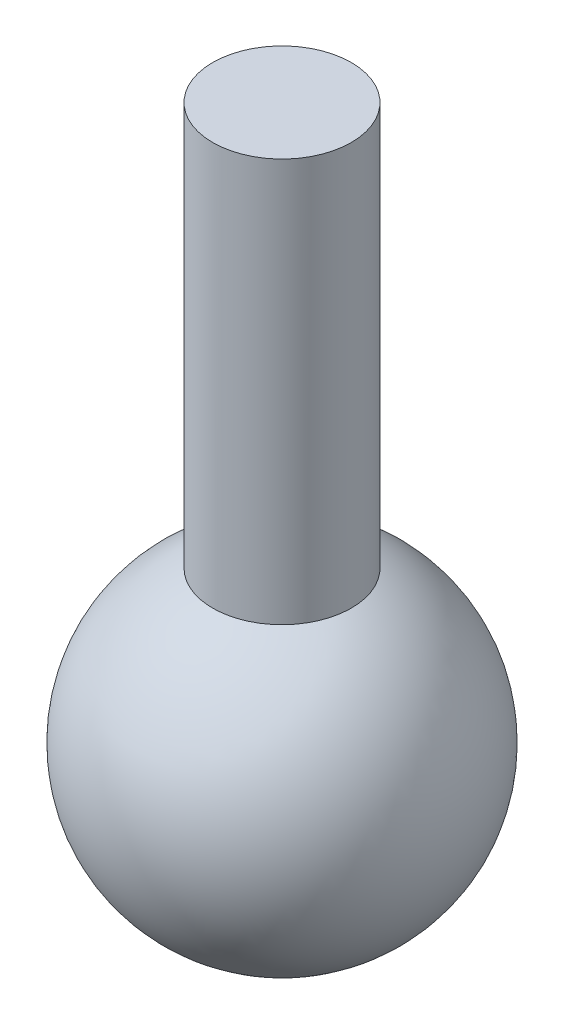
ISO-10303-21;
HEADER;
FILE_DESCRIPTION(('STEP AP214'),'2;1');
FILE_NAME('part.step','',(''),(''),'','','');
FILE_SCHEMA(('AUTOMOTIVE_DESIGN { 1 0 10303 214 1 1 1 1 }'));
ENDSEC;
DATA;
#1=APPLICATION_CONTEXT('core data for automotive mechanical design processes');
#2=APPLICATION_PROTOCOL_DEFINITION('international standard','automotive_design',2000,#1);
#3=PRODUCT_CONTEXT('',#1,'mechanical');
#4=PRODUCT('Part','Part','',(#3));
#5=PRODUCT_RELATED_PRODUCT_CATEGORY('part','',(#4));
#6=PRODUCT_DEFINITION_FORMATION('','',#4);
#7=PRODUCT_DEFINITION_CONTEXT('part definition',#1,'design');
#8=PRODUCT_DEFINITION('design','',#6,#7);
#9=PRODUCT_DEFINITION_SHAPE('','',#8);
#10=(LENGTH_UNIT() NAMED_UNIT(*) SI_UNIT(.MILLI.,.METRE.));
#11=(NAMED_UNIT(*) PLANE_ANGLE_UNIT() SI_UNIT($,.RADIAN.));
#12=(NAMED_UNIT(*) SI_UNIT($,.STERADIAN.) SOLID_ANGLE_UNIT());
#13=UNCERTAINTY_MEASURE_WITH_UNIT(LENGTH_MEASURE(1.E-05),#10,'distance_accuracy_value','');
#14=(GEOMETRIC_REPRESENTATION_CONTEXT(3) GLOBAL_UNCERTAINTY_ASSIGNED_CONTEXT((#13)) GLOBAL_UNIT_ASSIGNED_CONTEXT((#10,
#11,#12)) REPRESENTATION_CONTEXT('',''));
#15=CARTESIAN_POINT('',(0.,0.,0.));
#16=DIRECTION('',(0.,0.,1.));
#17=DIRECTION('',(1.,0.,0.));
#18=AXIS2_PLACEMENT_3D('',#15,#16,#17);
#19=CARTESIAN_POINT('',(0.,0.,0.));
#20=DIRECTION('',(0.,1.,0.));
#21=DIRECTION('',(0.,0.,-1.));
#22=AXIS2_PLACEMENT_3D('',#19,#20,#21);
#23=SPHERICAL_SURFACE('',#22,6.);
#24=CARTESIAN_POINT('',(0.,5.45435605731786,0.));
#25=DIRECTION('',(0.,-1.,0.));
#26=DIRECTION('',(0.,0.,-1.));
#27=AXIS2_PLACEMENT_3D('',#24,#25,#26);
#28=CIRCLE('',#27,2.5);
#29=CARTESIAN_POINT('',(0.,5.45435605731786,-2.5));
#30=VERTEX_POINT('',#29);
#31=EDGE_CURVE('E10',#30,#30,#28,.F.);
#32=ORIENTED_EDGE('',*,*,#31,.F.);
#33=EDGE_LOOP('',(#32));
#34=FACE_BOUND('',#33,.T.);
#35=ADVANCED_FACE('F37',(#34),#23,.T.);
#36=CARTESIAN_POINT('',(0.,20.,0.));
#37=DIRECTION('',(0.,-1.,0.));
#38=DIRECTION('',(0.,0.,-1.));
#39=AXIS2_PLACEMENT_3D('',#36,#37,#38);
#40=CYLINDRICAL_SURFACE('',#39,2.5);
#41=CARTESIAN_POINT('',(0.,20.,0.));
#42=DIRECTION('',(0.,1.,0.));
#43=DIRECTION('',(0.,0.,1.));
#44=AXIS2_PLACEMENT_3D('',#41,#42,#43);
#45=CIRCLE('',#44,2.5);
#46=CARTESIAN_POINT('',(0.,20.,2.5));
#47=VERTEX_POINT('',#46);
#48=EDGE_CURVE('E44',#47,#47,#45,.T.);
#49=ORIENTED_EDGE('',*,*,#48,.F.);
#50=EDGE_LOOP('',(#49));
#51=FACE_BOUND('',#50,.T.);
#52=ORIENTED_EDGE('',*,*,#31,.T.);
#53=EDGE_LOOP('',(#52));
#54=FACE_BOUND('',#53,.T.);
#55=ADVANCED_FACE('F53',(#51,#54),#40,.T.);
#56=CARTESIAN_POINT('',(0.,20.,0.));
#57=DIRECTION('',(0.,1.,0.));
#58=DIRECTION('',(0.,0.,1.));
#59=AXIS2_PLACEMENT_3D('',#56,#57,#58);
#60=PLANE('',#59);
#61=ORIENTED_EDGE('',*,*,#48,.T.);
#62=EDGE_LOOP('',(#61));
#63=FACE_BOUND('',#62,.T.);
#64=ADVANCED_FACE('F51',(#63),#60,.T.);
#65=CLOSED_SHELL('',(#35,#55,#64));
#66=MANIFOLD_SOLID_BREP('B2',#65);
#67=ADVANCED_BREP_SHAPE_REPRESENTATION('',(#18,#66),#14);
#68=SHAPE_DEFINITION_REPRESENTATION(#9,#67);
ENDSEC;
END-ISO-10303-21;
